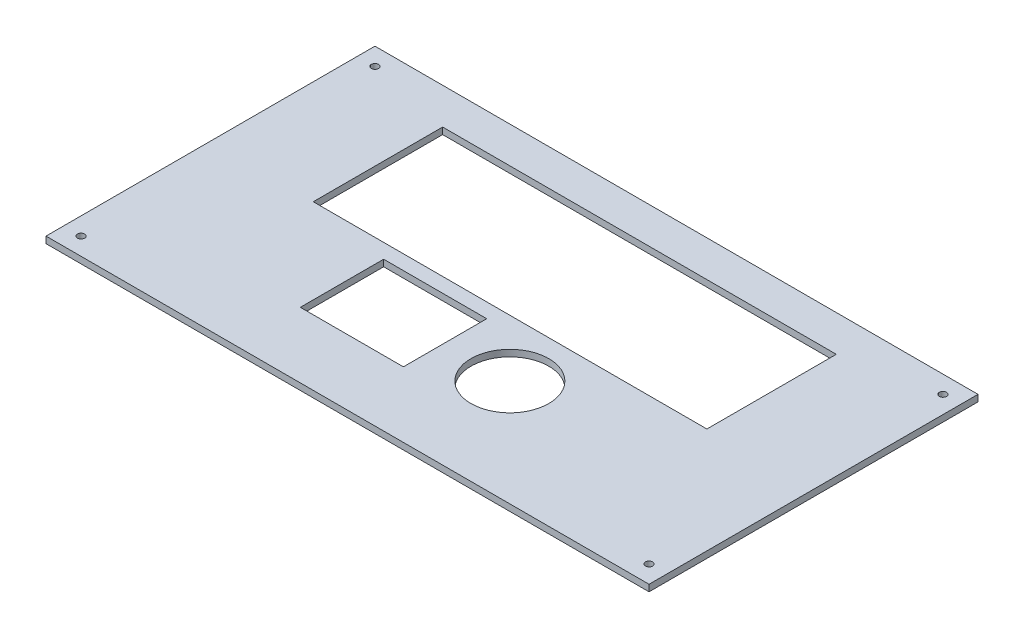
ISO-10303-21;
HEADER;
FILE_DESCRIPTION(('STEP AP214'),'2;1');
FILE_NAME('part.step','',(''),(''),'','','');
FILE_SCHEMA(('AUTOMOTIVE_DESIGN { 1 0 10303 214 1 1 1 1 }'));
ENDSEC;
DATA;
#1=APPLICATION_CONTEXT('core data for automotive mechanical design processes');
#2=APPLICATION_PROTOCOL_DEFINITION('international standard','automotive_design',2000,#1);
#3=PRODUCT_CONTEXT('',#1,'mechanical');
#4=PRODUCT('Part','Part','',(#3));
#5=PRODUCT_RELATED_PRODUCT_CATEGORY('part','',(#4));
#6=PRODUCT_DEFINITION_FORMATION('','',#4);
#7=PRODUCT_DEFINITION_CONTEXT('part definition',#1,'design');
#8=PRODUCT_DEFINITION('design','',#6,#7);
#9=PRODUCT_DEFINITION_SHAPE('','',#8);
#10=(LENGTH_UNIT() NAMED_UNIT(*) SI_UNIT(.MILLI.,.METRE.));
#11=(NAMED_UNIT(*) PLANE_ANGLE_UNIT() SI_UNIT($,.RADIAN.));
#12=(NAMED_UNIT(*) SI_UNIT($,.STERADIAN.) SOLID_ANGLE_UNIT());
#13=UNCERTAINTY_MEASURE_WITH_UNIT(LENGTH_MEASURE(1.E-05),#10,'distance_accuracy_value','');
#14=(GEOMETRIC_REPRESENTATION_CONTEXT(3) GLOBAL_UNCERTAINTY_ASSIGNED_CONTEXT((#13)) GLOBAL_UNIT_ASSIGNED_CONTEXT((#10,
#11,#12)) REPRESENTATION_CONTEXT('',''));
#15=CARTESIAN_POINT('',(0.,0.,0.));
#16=DIRECTION('',(0.,0.,1.));
#17=DIRECTION('',(1.,0.,0.));
#18=AXIS2_PLACEMENT_3D('',#15,#16,#17);
#19=CARTESIAN_POINT('',(0.,3.,0.));
#20=DIRECTION('',(0.,-1.,0.));
#21=DIRECTION('',(0.,0.,-1.));
#22=AXIS2_PLACEMENT_3D('',#19,#20,#21);
#23=PLANE('',#22);
#24=DIRECTION('',(0.,0.,1.));
#25=VECTOR('',#24,1.);
#26=CARTESIAN_POINT('',(-90.125,3.,-58.5));
#27=LINE('',#26,#25);
#28=CARTESIAN_POINT('',(-90.125,3.,-58.5));
#29=VERTEX_POINT('',#28);
#30=CARTESIAN_POINT('',(-90.125,3.,0.499999999999987));
#31=VERTEX_POINT('',#30);
#32=EDGE_CURVE('E164',#29,#31,#27,.T.);
#33=ORIENTED_EDGE('',*,*,#32,.F.);
#34=DIRECTION('',(-1.,0.,0.));
#35=VECTOR('',#34,1.);
#36=CARTESIAN_POINT('',(-90.125,3.,-58.5));
#37=LINE('',#36,#35);
#38=CARTESIAN_POINT('',(89.375,3.,-58.5));
#39=VERTEX_POINT('',#38);
#40=EDGE_CURVE('E172',#39,#29,#37,.T.);
#41=ORIENTED_EDGE('',*,*,#40,.F.);
#42=DIRECTION('',(0.,0.,-1.));
#43=VECTOR('',#42,1.);
#44=CARTESIAN_POINT('',(89.375,3.,-58.5));
#45=LINE('',#44,#43);
#46=CARTESIAN_POINT('',(89.375,3.,0.499999999999987));
#47=VERTEX_POINT('',#46);
#48=EDGE_CURVE('E169',#47,#39,#45,.T.);
#49=ORIENTED_EDGE('',*,*,#48,.F.);
#50=DIRECTION('',(1.,0.,0.));
#51=VECTOR('',#50,1.);
#52=CARTESIAN_POINT('',(-90.125,3.,0.499999999999987));
#53=LINE('',#52,#51);
#54=EDGE_CURVE('E166',#31,#47,#53,.T.);
#55=ORIENTED_EDGE('',*,*,#54,.F.);
#56=EDGE_LOOP('',(#33,#41,#49,#55));
#57=FACE_BOUND('',#56,.T.);
#58=DIRECTION('',(0.,0.,-1.));
#59=VECTOR('',#58,1.);
#60=CARTESIAN_POINT('',(137.5,3.,75.));
#61=LINE('',#60,#59);
#62=CARTESIAN_POINT('',(137.5,3.,75.));
#63=VERTEX_POINT('',#62);
#64=CARTESIAN_POINT('',(137.5,3.,-75.));
#65=VERTEX_POINT('',#64);
#66=EDGE_CURVE('E219',#63,#65,#61,.T.);
#67=ORIENTED_EDGE('',*,*,#66,.T.);
#68=DIRECTION('',(-1.,0.,0.));
#69=VECTOR('',#68,1.);
#70=CARTESIAN_POINT('',(-137.5,3.,-75.));
#71=LINE('',#70,#69);
#72=CARTESIAN_POINT('',(-137.5,3.,-75.));
#73=VERTEX_POINT('',#72);
#74=EDGE_CURVE('E222',#65,#73,#71,.T.);
#75=ORIENTED_EDGE('',*,*,#74,.T.);
#76=DIRECTION('',(0.,0.,1.));
#77=VECTOR('',#76,1.);
#78=CARTESIAN_POINT('',(-137.5,3.,75.));
#79=LINE('',#78,#77);
#80=CARTESIAN_POINT('',(-137.5,3.,75.));
#81=VERTEX_POINT('',#80);
#82=EDGE_CURVE('E225',#73,#81,#79,.T.);
#83=ORIENTED_EDGE('',*,*,#82,.T.);
#84=DIRECTION('',(1.,0.,0.));
#85=VECTOR('',#84,1.);
#86=CARTESIAN_POINT('',(-137.5,3.,75.));
#87=LINE('',#86,#85);
#88=EDGE_CURVE('E227',#81,#63,#87,.T.);
#89=ORIENTED_EDGE('',*,*,#88,.T.);
#90=EDGE_LOOP('',(#67,#75,#83,#89));
#91=FACE_BOUND('',#90,.T.);
#92=CARTESIAN_POINT('',(-129.5,3.,67.));
#93=DIRECTION('',(0.,1.,0.));
#94=DIRECTION('',(0.,0.,1.));
#95=AXIS2_PLACEMENT_3D('',#92,#93,#94);
#96=CIRCLE('',#95,1.65000000000002);
#97=CARTESIAN_POINT('',(-129.5,3.,68.65));
#98=VERTEX_POINT('',#97);
#99=EDGE_CURVE('E213',#98,#98,#96,.T.);
#100=ORIENTED_EDGE('',*,*,#99,.F.);
#101=EDGE_LOOP('',(#100));
#102=FACE_BOUND('',#101,.T.);
#103=CARTESIAN_POINT('',(129.5,3.,67.));
#104=DIRECTION('',(0.,1.,0.));
#105=DIRECTION('',(0.,0.,1.));
#106=AXIS2_PLACEMENT_3D('',#103,#104,#105);
#107=CIRCLE('',#106,1.65000000000002);
#108=CARTESIAN_POINT('',(129.5,3.,68.65));
#109=VERTEX_POINT('',#108);
#110=EDGE_CURVE('E207',#109,#109,#107,.T.);
#111=ORIENTED_EDGE('',*,*,#110,.F.);
#112=EDGE_LOOP('',(#111));
#113=FACE_BOUND('',#112,.T.);
#114=CARTESIAN_POINT('',(-129.5,3.,-67.));
#115=DIRECTION('',(0.,1.,0.));
#116=DIRECTION('',(0.,0.,1.));
#117=AXIS2_PLACEMENT_3D('',#114,#115,#116);
#118=CIRCLE('',#117,1.65000000000002);
#119=CARTESIAN_POINT('',(-129.5,3.,-65.35));
#120=VERTEX_POINT('',#119);
#121=EDGE_CURVE('E201',#120,#120,#118,.T.);
#122=ORIENTED_EDGE('',*,*,#121,.F.);
#123=EDGE_LOOP('',(#122));
#124=FACE_BOUND('',#123,.T.);
#125=CARTESIAN_POINT('',(129.5,3.,-67.));
#126=DIRECTION('',(0.,1.,0.));
#127=DIRECTION('',(0.,0.,1.));
#128=AXIS2_PLACEMENT_3D('',#125,#126,#127);
#129=CIRCLE('',#128,1.65000000000002);
#130=CARTESIAN_POINT('',(129.5,3.,-65.35));
#131=VERTEX_POINT('',#130);
#132=EDGE_CURVE('E195',#131,#131,#129,.T.);
#133=ORIENTED_EDGE('',*,*,#132,.F.);
#134=EDGE_LOOP('',(#133));
#135=FACE_BOUND('',#134,.T.);
#136=DIRECTION('',(0.,0.,1.));
#137=VECTOR('',#136,1.);
#138=CARTESIAN_POINT('',(-51.375,3.,45.15));
#139=LINE('',#138,#137);
#140=CARTESIAN_POINT('',(-51.375,3.,7.14999999999998));
#141=VERTEX_POINT('',#140);
#142=CARTESIAN_POINT('',(-51.375,3.,45.15));
#143=VERTEX_POINT('',#142);
#144=EDGE_CURVE('E125',#141,#143,#139,.T.);
#145=ORIENTED_EDGE('',*,*,#144,.F.);
#146=DIRECTION('',(-1.,0.,0.));
#147=VECTOR('',#146,1.);
#148=CARTESIAN_POINT('',(-51.375,3.,7.14999999999998));
#149=LINE('',#148,#147);
#150=CARTESIAN_POINT('',(-4.37499999999999,3.,7.14999999999998));
#151=VERTEX_POINT('',#150);
#152=EDGE_CURVE('E148',#151,#141,#149,.T.);
#153=ORIENTED_EDGE('',*,*,#152,.F.);
#154=DIRECTION('',(0.,0.,-1.));
#155=VECTOR('',#154,1.);
#156=CARTESIAN_POINT('',(-4.37499999999999,3.,45.15));
#157=LINE('',#156,#155);
#158=CARTESIAN_POINT('',(-4.37499999999999,3.,45.15));
#159=VERTEX_POINT('',#158);
#160=EDGE_CURVE('E146',#159,#151,#157,.T.);
#161=ORIENTED_EDGE('',*,*,#160,.F.);
#162=DIRECTION('',(1.,0.,0.));
#163=VECTOR('',#162,1.);
#164=CARTESIAN_POINT('',(-51.375,3.,45.15));
#165=LINE('',#164,#163);
#166=EDGE_CURVE('E133',#143,#159,#165,.T.);
#167=ORIENTED_EDGE('',*,*,#166,.F.);
#168=EDGE_LOOP('',(#145,#153,#161,#167));
#169=FACE_BOUND('',#168,.T.);
#170=CARTESIAN_POINT('',(25.525,3.,26.5));
#171=DIRECTION('',(0.,1.,0.));
#172=DIRECTION('',(0.,0.,1.));
#173=AXIS2_PLACEMENT_3D('',#170,#171,#172);
#174=CIRCLE('',#173,17.75);
#175=CARTESIAN_POINT('',(25.525,3.,44.25));
#176=VERTEX_POINT('',#175);
#177=EDGE_CURVE('E154',#176,#176,#174,.T.);
#178=ORIENTED_EDGE('',*,*,#177,.F.);
#179=EDGE_LOOP('',(#178));
#180=FACE_BOUND('',#179,.T.);
#181=ADVANCED_FACE('F36',(#57,#91,#102,#113,#124,#135,#169,#180),#23,.F.);
#182=CARTESIAN_POINT('',(0.,0.,0.));
#183=DIRECTION('',(0.,-1.,0.));
#184=DIRECTION('',(0.,0.,-1.));
#185=AXIS2_PLACEMENT_3D('',#182,#183,#184);
#186=PLANE('',#185);
#187=DIRECTION('',(-1.,0.,0.));
#188=VECTOR('',#187,1.);
#189=CARTESIAN_POINT('',(-51.375,0.,7.14999999999998));
#190=LINE('',#189,#188);
#191=CARTESIAN_POINT('',(-4.37499999999999,0.,7.14999999999998));
#192=VERTEX_POINT('',#191);
#193=CARTESIAN_POINT('',(-51.375,0.,7.14999999999998));
#194=VERTEX_POINT('',#193);
#195=EDGE_CURVE('E134',#192,#194,#190,.T.);
#196=ORIENTED_EDGE('',*,*,#195,.T.);
#197=DIRECTION('',(0.,0.,1.));
#198=VECTOR('',#197,1.);
#199=CARTESIAN_POINT('',(-51.375,0.,45.15));
#200=LINE('',#199,#198);
#201=CARTESIAN_POINT('',(-51.375,0.,45.15));
#202=VERTEX_POINT('',#201);
#203=EDGE_CURVE('E59',#194,#202,#200,.T.);
#204=ORIENTED_EDGE('',*,*,#203,.T.);
#205=DIRECTION('',(1.,0.,0.));
#206=VECTOR('',#205,1.);
#207=CARTESIAN_POINT('',(-51.375,0.,45.15));
#208=LINE('',#207,#206);
#209=CARTESIAN_POINT('',(-4.37499999999999,0.,45.15));
#210=VERTEX_POINT('',#209);
#211=EDGE_CURVE('E140',#202,#210,#208,.T.);
#212=ORIENTED_EDGE('',*,*,#211,.T.);
#213=DIRECTION('',(0.,0.,-1.));
#214=VECTOR('',#213,1.);
#215=CARTESIAN_POINT('',(-4.37499999999999,0.,45.15));
#216=LINE('',#215,#214);
#217=EDGE_CURVE('E156',#210,#192,#216,.T.);
#218=ORIENTED_EDGE('',*,*,#217,.T.);
#219=EDGE_LOOP('',(#196,#204,#212,#218));
#220=FACE_BOUND('',#219,.T.);
#221=DIRECTION('',(-1.,0.,0.));
#222=VECTOR('',#221,1.);
#223=CARTESIAN_POINT('',(-90.125,0.,-58.5));
#224=LINE('',#223,#222);
#225=CARTESIAN_POINT('',(89.375,0.,-58.5));
#226=VERTEX_POINT('',#225);
#227=CARTESIAN_POINT('',(-90.125,0.,-58.5));
#228=VERTEX_POINT('',#227);
#229=EDGE_CURVE('E167',#226,#228,#224,.T.);
#230=ORIENTED_EDGE('',*,*,#229,.T.);
#231=DIRECTION('',(0.,0.,1.));
#232=VECTOR('',#231,1.);
#233=CARTESIAN_POINT('',(-90.125,0.,-58.5));
#234=LINE('',#233,#232);
#235=CARTESIAN_POINT('',(-90.125,0.,0.499999999999987));
#236=VERTEX_POINT('',#235);
#237=EDGE_CURVE('E141',#228,#236,#234,.T.);
#238=ORIENTED_EDGE('',*,*,#237,.T.);
#239=DIRECTION('',(1.,0.,0.));
#240=VECTOR('',#239,1.);
#241=CARTESIAN_POINT('',(-90.125,0.,0.499999999999987));
#242=LINE('',#241,#240);
#243=CARTESIAN_POINT('',(89.375,0.,0.499999999999987));
#244=VERTEX_POINT('',#243);
#245=EDGE_CURVE('E177',#236,#244,#242,.T.);
#246=ORIENTED_EDGE('',*,*,#245,.T.);
#247=DIRECTION('',(0.,0.,-1.));
#248=VECTOR('',#247,1.);
#249=CARTESIAN_POINT('',(89.375,0.,-58.5));
#250=LINE('',#249,#248);
#251=EDGE_CURVE('E180',#244,#226,#250,.T.);
#252=ORIENTED_EDGE('',*,*,#251,.T.);
#253=EDGE_LOOP('',(#230,#238,#246,#252));
#254=FACE_BOUND('',#253,.T.);
#255=CARTESIAN_POINT('',(129.5,0.,-67.));
#256=DIRECTION('',(0.,1.,0.));
#257=DIRECTION('',(0.,0.,1.));
#258=AXIS2_PLACEMENT_3D('',#255,#256,#257);
#259=CIRCLE('',#258,1.65000000000002);
#260=CARTESIAN_POINT('',(129.5,0.,-65.35));
#261=VERTEX_POINT('',#260);
#262=EDGE_CURVE('E194',#261,#261,#259,.T.);
#263=ORIENTED_EDGE('',*,*,#262,.T.);
#264=EDGE_LOOP('',(#263));
#265=FACE_BOUND('',#264,.T.);
#266=CARTESIAN_POINT('',(129.5,0.,67.));
#267=DIRECTION('',(0.,1.,0.));
#268=DIRECTION('',(0.,0.,1.));
#269=AXIS2_PLACEMENT_3D('',#266,#267,#268);
#270=CIRCLE('',#269,1.65000000000002);
#271=CARTESIAN_POINT('',(129.5,0.,68.65));
#272=VERTEX_POINT('',#271);
#273=EDGE_CURVE('E204',#272,#272,#270,.T.);
#274=ORIENTED_EDGE('',*,*,#273,.T.);
#275=EDGE_LOOP('',(#274));
#276=FACE_BOUND('',#275,.T.);
#277=DIRECTION('',(0.,0.,-1.));
#278=VECTOR('',#277,1.);
#279=CARTESIAN_POINT('',(137.5,0.,75.));
#280=LINE('',#279,#278);
#281=CARTESIAN_POINT('',(137.5,0.,75.));
#282=VERTEX_POINT('',#281);
#283=CARTESIAN_POINT('',(137.5,0.,-75.));
#284=VERTEX_POINT('',#283);
#285=EDGE_CURVE('E216',#282,#284,#280,.T.);
#286=ORIENTED_EDGE('',*,*,#285,.F.);
#287=DIRECTION('',(1.,0.,0.));
#288=VECTOR('',#287,1.);
#289=CARTESIAN_POINT('',(-137.5,0.,75.));
#290=LINE('',#289,#288);
#291=CARTESIAN_POINT('',(-137.5,0.,75.));
#292=VERTEX_POINT('',#291);
#293=EDGE_CURVE('E223',#292,#282,#290,.T.);
#294=ORIENTED_EDGE('',*,*,#293,.F.);
#295=DIRECTION('',(0.,0.,1.));
#296=VECTOR('',#295,1.);
#297=CARTESIAN_POINT('',(-137.5,0.,75.));
#298=LINE('',#297,#296);
#299=CARTESIAN_POINT('',(-137.5,0.,-75.));
#300=VERTEX_POINT('',#299);
#301=EDGE_CURVE('E234',#300,#292,#298,.T.);
#302=ORIENTED_EDGE('',*,*,#301,.F.);
#303=DIRECTION('',(-1.,0.,0.));
#304=VECTOR('',#303,1.);
#305=CARTESIAN_POINT('',(-137.5,0.,-75.));
#306=LINE('',#305,#304);
#307=EDGE_CURVE('E232',#284,#300,#306,.T.);
#308=ORIENTED_EDGE('',*,*,#307,.F.);
#309=EDGE_LOOP('',(#286,#294,#302,#308));
#310=FACE_BOUND('',#309,.T.);
#311=CARTESIAN_POINT('',(-129.5,0.,67.));
#312=DIRECTION('',(0.,1.,0.));
#313=DIRECTION('',(0.,0.,1.));
#314=AXIS2_PLACEMENT_3D('',#311,#312,#313);
#315=CIRCLE('',#314,1.65000000000002);
#316=CARTESIAN_POINT('',(-129.5,0.,68.65));
#317=VERTEX_POINT('',#316);
#318=EDGE_CURVE('E210',#317,#317,#315,.T.);
#319=ORIENTED_EDGE('',*,*,#318,.T.);
#320=EDGE_LOOP('',(#319));
#321=FACE_BOUND('',#320,.T.);
#322=CARTESIAN_POINT('',(-129.5,0.,-67.));
#323=DIRECTION('',(0.,1.,0.));
#324=DIRECTION('',(0.,0.,1.));
#325=AXIS2_PLACEMENT_3D('',#322,#323,#324);
#326=CIRCLE('',#325,1.65000000000002);
#327=CARTESIAN_POINT('',(-129.5,0.,-65.35));
#328=VERTEX_POINT('',#327);
#329=EDGE_CURVE('E198',#328,#328,#326,.T.);
#330=ORIENTED_EDGE('',*,*,#329,.T.);
#331=EDGE_LOOP('',(#330));
#332=FACE_BOUND('',#331,.T.);
#333=CARTESIAN_POINT('',(25.525,0.,26.5));
#334=DIRECTION('',(0.,1.,0.));
#335=DIRECTION('',(0.,0.,1.));
#336=AXIS2_PLACEMENT_3D('',#333,#334,#335);
#337=CIRCLE('',#336,17.75);
#338=CARTESIAN_POINT('',(25.525,0.,44.25));
#339=VERTEX_POINT('',#338);
#340=EDGE_CURVE('E302',#339,#339,#337,.T.);
#341=ORIENTED_EDGE('',*,*,#340,.T.);
#342=EDGE_LOOP('',(#341));
#343=FACE_BOUND('',#342,.T.);
#344=ADVANCED_FACE('F252',(#220,#254,#265,#276,#310,#321,#332,#343),#186,.T.);
#345=CARTESIAN_POINT('',(137.5,3.,75.));
#346=DIRECTION('',(-1.,0.,0.));
#347=DIRECTION('',(0.,0.,1.));
#348=AXIS2_PLACEMENT_3D('',#345,#346,#347);
#349=PLANE('',#348);
#350=ORIENTED_EDGE('',*,*,#285,.T.);
#351=DIRECTION('',(0.,-1.,0.));
#352=VECTOR('',#351,1.);
#353=CARTESIAN_POINT('',(137.5,3.,-75.));
#354=LINE('',#353,#352);
#355=EDGE_CURVE('E11',#65,#284,#354,.T.);
#356=ORIENTED_EDGE('',*,*,#355,.F.);
#357=ORIENTED_EDGE('',*,*,#66,.F.);
#358=DIRECTION('',(0.,-1.,0.));
#359=VECTOR('',#358,1.);
#360=CARTESIAN_POINT('',(137.5,3.,75.));
#361=LINE('',#360,#359);
#362=EDGE_CURVE('E229',#63,#282,#361,.T.);
#363=ORIENTED_EDGE('',*,*,#362,.T.);
#364=EDGE_LOOP('',(#350,#356,#357,#363));
#365=FACE_BOUND('',#364,.T.);
#366=ADVANCED_FACE('F38',(#365),#349,.F.);
#367=CARTESIAN_POINT('',(-137.5,3.,-75.));
#368=DIRECTION('',(0.,0.,1.));
#369=DIRECTION('',(1.,0.,0.));
#370=AXIS2_PLACEMENT_3D('',#367,#368,#369);
#371=PLANE('',#370);
#372=ORIENTED_EDGE('',*,*,#307,.T.);
#373=DIRECTION('',(0.,-1.,0.));
#374=VECTOR('',#373,1.);
#375=CARTESIAN_POINT('',(-137.5,3.,-75.));
#376=LINE('',#375,#374);
#377=EDGE_CURVE('E44',#73,#300,#376,.T.);
#378=ORIENTED_EDGE('',*,*,#377,.F.);
#379=ORIENTED_EDGE('',*,*,#74,.F.);
#380=ORIENTED_EDGE('',*,*,#355,.T.);
#381=EDGE_LOOP('',(#372,#378,#379,#380));
#382=FACE_BOUND('',#381,.T.);
#383=ADVANCED_FACE('F263',(#382),#371,.F.);
#384=CARTESIAN_POINT('',(-137.5,3.,75.));
#385=DIRECTION('',(1.,0.,0.));
#386=DIRECTION('',(0.,0.,-1.));
#387=AXIS2_PLACEMENT_3D('',#384,#385,#386);
#388=PLANE('',#387);
#389=ORIENTED_EDGE('',*,*,#301,.T.);
#390=DIRECTION('',(0.,-1.,0.));
#391=VECTOR('',#390,1.);
#392=CARTESIAN_POINT('',(-137.5,3.,75.));
#393=LINE('',#392,#391);
#394=EDGE_CURVE('E239',#81,#292,#393,.T.);
#395=ORIENTED_EDGE('',*,*,#394,.F.);
#396=ORIENTED_EDGE('',*,*,#82,.F.);
#397=ORIENTED_EDGE('',*,*,#377,.T.);
#398=EDGE_LOOP('',(#389,#395,#396,#397));
#399=FACE_BOUND('',#398,.T.);
#400=ADVANCED_FACE('F246',(#399),#388,.F.);
#401=CARTESIAN_POINT('',(-137.5,3.,75.));
#402=DIRECTION('',(0.,0.,-1.));
#403=DIRECTION('',(-1.,0.,0.));
#404=AXIS2_PLACEMENT_3D('',#401,#402,#403);
#405=PLANE('',#404);
#406=ORIENTED_EDGE('',*,*,#293,.T.);
#407=ORIENTED_EDGE('',*,*,#362,.F.);
#408=ORIENTED_EDGE('',*,*,#88,.F.);
#409=ORIENTED_EDGE('',*,*,#394,.T.);
#410=EDGE_LOOP('',(#406,#407,#408,#409));
#411=FACE_BOUND('',#410,.T.);
#412=ADVANCED_FACE('F256',(#411),#405,.F.);
#413=CARTESIAN_POINT('',(-129.5,3.,67.));
#414=DIRECTION('',(0.,-1.,0.));
#415=DIRECTION('',(0.,0.,-1.));
#416=AXIS2_PLACEMENT_3D('',#413,#414,#415);
#417=CYLINDRICAL_SURFACE('',#416,1.65000000000002);
#418=ORIENTED_EDGE('',*,*,#99,.T.);
#419=EDGE_LOOP('',(#418));
#420=FACE_BOUND('',#419,.T.);
#421=ORIENTED_EDGE('',*,*,#318,.F.);
#422=EDGE_LOOP('',(#421));
#423=FACE_BOUND('',#422,.T.);
#424=ADVANCED_FACE('F280',(#420,#423),#417,.F.);
#425=CARTESIAN_POINT('',(129.5,3.,67.));
#426=DIRECTION('',(0.,-1.,0.));
#427=DIRECTION('',(0.,0.,-1.));
#428=AXIS2_PLACEMENT_3D('',#425,#426,#427);
#429=CYLINDRICAL_SURFACE('',#428,1.65000000000002);
#430=ORIENTED_EDGE('',*,*,#110,.T.);
#431=EDGE_LOOP('',(#430));
#432=FACE_BOUND('',#431,.T.);
#433=ORIENTED_EDGE('',*,*,#273,.F.);
#434=EDGE_LOOP('',(#433));
#435=FACE_BOUND('',#434,.T.);
#436=ADVANCED_FACE('F287',(#432,#435),#429,.F.);
#437=CARTESIAN_POINT('',(-129.5,3.,-67.));
#438=DIRECTION('',(0.,-1.,0.));
#439=DIRECTION('',(0.,0.,-1.));
#440=AXIS2_PLACEMENT_3D('',#437,#438,#439);
#441=CYLINDRICAL_SURFACE('',#440,1.65000000000002);
#442=ORIENTED_EDGE('',*,*,#121,.T.);
#443=EDGE_LOOP('',(#442));
#444=FACE_BOUND('',#443,.T.);
#445=ORIENTED_EDGE('',*,*,#329,.F.);
#446=EDGE_LOOP('',(#445));
#447=FACE_BOUND('',#446,.T.);
#448=ADVANCED_FACE('F292',(#444,#447),#441,.F.);
#449=CARTESIAN_POINT('',(129.5,3.,-67.));
#450=DIRECTION('',(0.,-1.,0.));
#451=DIRECTION('',(0.,0.,-1.));
#452=AXIS2_PLACEMENT_3D('',#449,#450,#451);
#453=CYLINDRICAL_SURFACE('',#452,1.65000000000002);
#454=ORIENTED_EDGE('',*,*,#132,.T.);
#455=EDGE_LOOP('',(#454));
#456=FACE_BOUND('',#455,.T.);
#457=ORIENTED_EDGE('',*,*,#262,.F.);
#458=EDGE_LOOP('',(#457));
#459=FACE_BOUND('',#458,.T.);
#460=ADVANCED_FACE('F340',(#456,#459),#453,.F.);
#461=CARTESIAN_POINT('',(-90.125,3.,-58.5));
#462=DIRECTION('',(1.,0.,0.));
#463=DIRECTION('',(0.,0.,-1.));
#464=AXIS2_PLACEMENT_3D('',#461,#462,#463);
#465=PLANE('',#464);
#466=ORIENTED_EDGE('',*,*,#237,.F.);
#467=DIRECTION('',(0.,-1.,0.));
#468=VECTOR('',#467,1.);
#469=CARTESIAN_POINT('',(-90.125,3.,-58.5));
#470=LINE('',#469,#468);
#471=EDGE_CURVE('E174',#29,#228,#470,.T.);
#472=ORIENTED_EDGE('',*,*,#471,.F.);
#473=ORIENTED_EDGE('',*,*,#32,.T.);
#474=DIRECTION('',(0.,-1.,0.));
#475=VECTOR('',#474,1.);
#476=CARTESIAN_POINT('',(-90.125,3.,0.499999999999987));
#477=LINE('',#476,#475);
#478=EDGE_CURVE('E191',#31,#236,#477,.T.);
#479=ORIENTED_EDGE('',*,*,#478,.T.);
#480=EDGE_LOOP('',(#466,#472,#473,#479));
#481=FACE_BOUND('',#480,.T.);
#482=ADVANCED_FACE('F336',(#481),#465,.T.);
#483=CARTESIAN_POINT('',(-90.125,3.,0.499999999999987));
#484=DIRECTION('',(0.,0.,-1.));
#485=DIRECTION('',(-1.,0.,0.));
#486=AXIS2_PLACEMENT_3D('',#483,#484,#485);
#487=PLANE('',#486);
#488=ORIENTED_EDGE('',*,*,#245,.F.);
#489=ORIENTED_EDGE('',*,*,#478,.F.);
#490=ORIENTED_EDGE('',*,*,#54,.T.);
#491=DIRECTION('',(0.,-1.,0.));
#492=VECTOR('',#491,1.);
#493=CARTESIAN_POINT('',(89.375,3.,0.499999999999987));
#494=LINE('',#493,#492);
#495=EDGE_CURVE('E189',#47,#244,#494,.T.);
#496=ORIENTED_EDGE('',*,*,#495,.T.);
#497=EDGE_LOOP('',(#488,#489,#490,#496));
#498=FACE_BOUND('',#497,.T.);
#499=ADVANCED_FACE('F332',(#498),#487,.T.);
#500=CARTESIAN_POINT('',(89.375,3.,-58.5));
#501=DIRECTION('',(-1.,0.,0.));
#502=DIRECTION('',(0.,0.,1.));
#503=AXIS2_PLACEMENT_3D('',#500,#501,#502);
#504=PLANE('',#503);
#505=ORIENTED_EDGE('',*,*,#251,.F.);
#506=ORIENTED_EDGE('',*,*,#495,.F.);
#507=ORIENTED_EDGE('',*,*,#48,.T.);
#508=DIRECTION('',(0.,-1.,0.));
#509=VECTOR('',#508,1.);
#510=CARTESIAN_POINT('',(89.375,3.,-58.5));
#511=LINE('',#510,#509);
#512=EDGE_CURVE('E187',#39,#226,#511,.T.);
#513=ORIENTED_EDGE('',*,*,#512,.T.);
#514=EDGE_LOOP('',(#505,#506,#507,#513));
#515=FACE_BOUND('',#514,.T.);
#516=ADVANCED_FACE('F328',(#515),#504,.T.);
#517=CARTESIAN_POINT('',(-90.125,3.,-58.5));
#518=DIRECTION('',(0.,0.,1.));
#519=DIRECTION('',(1.,0.,0.));
#520=AXIS2_PLACEMENT_3D('',#517,#518,#519);
#521=PLANE('',#520);
#522=ORIENTED_EDGE('',*,*,#229,.F.);
#523=ORIENTED_EDGE('',*,*,#512,.F.);
#524=ORIENTED_EDGE('',*,*,#40,.T.);
#525=ORIENTED_EDGE('',*,*,#471,.T.);
#526=EDGE_LOOP('',(#522,#523,#524,#525));
#527=FACE_BOUND('',#526,.T.);
#528=ADVANCED_FACE('F325',(#527),#521,.T.);
#529=CARTESIAN_POINT('',(-51.375,3.,45.15));
#530=DIRECTION('',(1.,0.,0.));
#531=DIRECTION('',(0.,0.,-1.));
#532=AXIS2_PLACEMENT_3D('',#529,#530,#531);
#533=PLANE('',#532);
#534=ORIENTED_EDGE('',*,*,#203,.F.);
#535=DIRECTION('',(0.,-1.,0.));
#536=VECTOR('',#535,1.);
#537=CARTESIAN_POINT('',(-51.375,3.,7.14999999999998));
#538=LINE('',#537,#536);
#539=EDGE_CURVE('E129',#141,#194,#538,.T.);
#540=ORIENTED_EDGE('',*,*,#539,.F.);
#541=ORIENTED_EDGE('',*,*,#144,.T.);
#542=DIRECTION('',(0.,-1.,0.));
#543=VECTOR('',#542,1.);
#544=CARTESIAN_POINT('',(-51.375,3.,45.15));
#545=LINE('',#544,#543);
#546=EDGE_CURVE('E128',#143,#202,#545,.T.);
#547=ORIENTED_EDGE('',*,*,#546,.T.);
#548=EDGE_LOOP('',(#534,#540,#541,#547));
#549=FACE_BOUND('',#548,.T.);
#550=ADVANCED_FACE('F127',(#549),#533,.T.);
#551=CARTESIAN_POINT('',(-51.375,3.,45.15));
#552=DIRECTION('',(0.,0.,-1.));
#553=DIRECTION('',(-1.,0.,0.));
#554=AXIS2_PLACEMENT_3D('',#551,#552,#553);
#555=PLANE('',#554);
#556=ORIENTED_EDGE('',*,*,#211,.F.);
#557=ORIENTED_EDGE('',*,*,#546,.F.);
#558=ORIENTED_EDGE('',*,*,#166,.T.);
#559=DIRECTION('',(0.,-1.,0.));
#560=VECTOR('',#559,1.);
#561=CARTESIAN_POINT('',(-4.37499999999999,3.,45.15));
#562=LINE('',#561,#560);
#563=EDGE_CURVE('E142',#159,#210,#562,.T.);
#564=ORIENTED_EDGE('',*,*,#563,.T.);
#565=EDGE_LOOP('',(#556,#557,#558,#564));
#566=FACE_BOUND('',#565,.T.);
#567=ADVANCED_FACE('F137',(#566),#555,.T.);
#568=CARTESIAN_POINT('',(-4.37499999999999,3.,45.15));
#569=DIRECTION('',(-1.,0.,0.));
#570=DIRECTION('',(0.,0.,1.));
#571=AXIS2_PLACEMENT_3D('',#568,#569,#570);
#572=PLANE('',#571);
#573=ORIENTED_EDGE('',*,*,#217,.F.);
#574=ORIENTED_EDGE('',*,*,#563,.F.);
#575=ORIENTED_EDGE('',*,*,#160,.T.);
#576=DIRECTION('',(0.,-1.,0.));
#577=VECTOR('',#576,1.);
#578=CARTESIAN_POINT('',(-4.37499999999999,3.,7.14999999999998));
#579=LINE('',#578,#577);
#580=EDGE_CURVE('E51',#151,#192,#579,.T.);
#581=ORIENTED_EDGE('',*,*,#580,.T.);
#582=EDGE_LOOP('',(#573,#574,#575,#581));
#583=FACE_BOUND('',#582,.T.);
#584=ADVANCED_FACE('F315',(#583),#572,.T.);
#585=CARTESIAN_POINT('',(-51.375,3.,7.14999999999998));
#586=DIRECTION('',(0.,0.,1.));
#587=DIRECTION('',(1.,0.,0.));
#588=AXIS2_PLACEMENT_3D('',#585,#586,#587);
#589=PLANE('',#588);
#590=ORIENTED_EDGE('',*,*,#195,.F.);
#591=ORIENTED_EDGE('',*,*,#580,.F.);
#592=ORIENTED_EDGE('',*,*,#152,.T.);
#593=ORIENTED_EDGE('',*,*,#539,.T.);
#594=EDGE_LOOP('',(#590,#591,#592,#593));
#595=FACE_BOUND('',#594,.T.);
#596=ADVANCED_FACE('F310',(#595),#589,.T.);
#597=CARTESIAN_POINT('',(25.525,3.,26.5));
#598=DIRECTION('',(0.,-1.,0.));
#599=DIRECTION('',(0.,0.,-1.));
#600=AXIS2_PLACEMENT_3D('',#597,#598,#599);
#601=CYLINDRICAL_SURFACE('',#600,17.75);
#602=ORIENTED_EDGE('',*,*,#177,.T.);
#603=EDGE_LOOP('',(#602));
#604=FACE_BOUND('',#603,.T.);
#605=ORIENTED_EDGE('',*,*,#340,.F.);
#606=EDGE_LOOP('',(#605));
#607=FACE_BOUND('',#606,.T.);
#608=ADVANCED_FACE('F308',(#604,#607),#601,.F.);
#609=CLOSED_SHELL('',(#181,#344,#366,#383,#400,#412,#424,#436,#448,#460,#482,#499,#516,#528,
#550,#567,#584,#596,#608));
#610=MANIFOLD_SOLID_BREP('B2',#609);
#611=ADVANCED_BREP_SHAPE_REPRESENTATION('',(#18,#610),#14);
#612=SHAPE_DEFINITION_REPRESENTATION(#9,#611);
ENDSEC;
END-ISO-10303-21;
